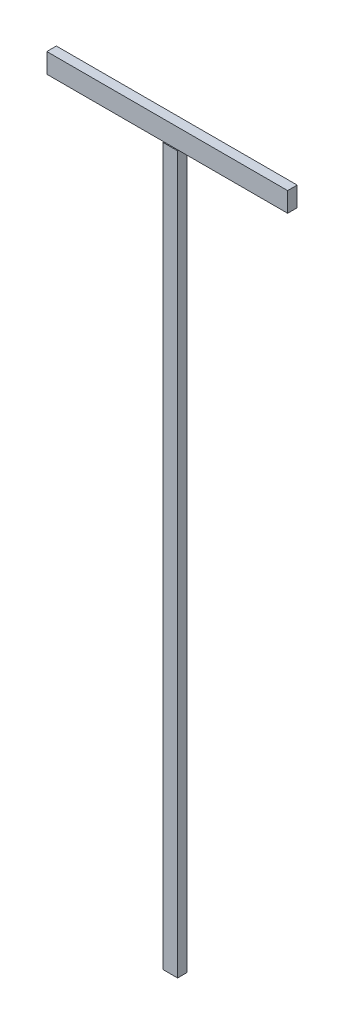
ISO-10303-21;
HEADER;
FILE_DESCRIPTION(('STEP AP214'),'2;1');
FILE_NAME('part.step','',(''),(''),'','','');
FILE_SCHEMA(('AUTOMOTIVE_DESIGN { 1 0 10303 214 1 1 1 1 }'));
ENDSEC;
DATA;
#1=APPLICATION_CONTEXT('core data for automotive mechanical design processes');
#2=APPLICATION_PROTOCOL_DEFINITION('international standard','automotive_design',2000,#1);
#3=PRODUCT_CONTEXT('',#1,'mechanical');
#4=PRODUCT('Part','Part','',(#3));
#5=PRODUCT_RELATED_PRODUCT_CATEGORY('part','',(#4));
#6=PRODUCT_DEFINITION_FORMATION('','',#4);
#7=PRODUCT_DEFINITION_CONTEXT('part definition',#1,'design');
#8=PRODUCT_DEFINITION('design','',#6,#7);
#9=PRODUCT_DEFINITION_SHAPE('','',#8);
#10=(LENGTH_UNIT() NAMED_UNIT(*) SI_UNIT(.MILLI.,.METRE.));
#11=(NAMED_UNIT(*) PLANE_ANGLE_UNIT() SI_UNIT($,.RADIAN.));
#12=(NAMED_UNIT(*) SI_UNIT($,.STERADIAN.) SOLID_ANGLE_UNIT());
#13=UNCERTAINTY_MEASURE_WITH_UNIT(LENGTH_MEASURE(1.E-05),#10,'distance_accuracy_value','');
#14=(GEOMETRIC_REPRESENTATION_CONTEXT(3) GLOBAL_UNCERTAINTY_ASSIGNED_CONTEXT((#13)) GLOBAL_UNIT_ASSIGNED_CONTEXT((#10,
#11,#12)) REPRESENTATION_CONTEXT('',''));
#15=CARTESIAN_POINT('',(0.,0.,0.));
#16=DIRECTION('',(0.,0.,1.));
#17=DIRECTION('',(1.,0.,0.));
#18=AXIS2_PLACEMENT_3D('',#15,#16,#17);
#19=CARTESIAN_POINT('',(51.7854430086385,-724.036701923933,10.));
#20=DIRECTION('',(0.,1.,0.));
#21=DIRECTION('',(0.,0.,1.));
#22=AXIS2_PLACEMENT_3D('',#19,#20,#21);
#23=PLANE('',#22);
#24=DIRECTION('',(1.,0.,0.));
#25=VECTOR('',#24,1.);
#26=CARTESIAN_POINT('',(51.7854430086385,-724.036701923933,0.));
#27=LINE('',#26,#25);
#28=CARTESIAN_POINT('',(51.7854430086385,-724.036701923933,0.));
#29=VERTEX_POINT('',#28);
#30=CARTESIAN_POINT('',(67.1330042148025,-724.036701923933,0.));
#31=VERTEX_POINT('',#30);
#32=EDGE_CURVE('E12',#29,#31,#27,.T.);
#33=ORIENTED_EDGE('',*,*,#32,.T.);
#34=DIRECTION('',(0.,0.,-1.));
#35=VECTOR('',#34,1.);
#36=CARTESIAN_POINT('',(67.1330042148025,-724.036701923933,10.));
#37=LINE('',#36,#35);
#38=CARTESIAN_POINT('',(67.1330042148025,-724.036701923933,10.));
#39=VERTEX_POINT('',#38);
#40=EDGE_CURVE('E66',#39,#31,#37,.T.);
#41=ORIENTED_EDGE('',*,*,#40,.F.);
#42=DIRECTION('',(1.,0.,0.));
#43=VECTOR('',#42,1.);
#44=CARTESIAN_POINT('',(51.7854430086385,-724.036701923933,10.));
#45=LINE('',#44,#43);
#46=CARTESIAN_POINT('',(51.7854430086385,-724.036701923933,10.));
#47=VERTEX_POINT('',#46);
#48=EDGE_CURVE('E51',#47,#39,#45,.T.);
#49=ORIENTED_EDGE('',*,*,#48,.F.);
#50=DIRECTION('',(0.,0.,-1.));
#51=VECTOR('',#50,1.);
#52=CARTESIAN_POINT('',(51.7854430086385,-724.036701923933,10.));
#53=LINE('',#52,#51);
#54=EDGE_CURVE('E101',#47,#29,#53,.T.);
#55=ORIENTED_EDGE('',*,*,#54,.T.);
#56=EDGE_LOOP('',(#33,#41,#49,#55));
#57=FACE_BOUND('',#56,.T.);
#58=ADVANCED_FACE('F47',(#57),#23,.F.);
#59=CARTESIAN_POINT('',(67.1330042148024,25.504850539847,10.));
#60=DIRECTION('',(1.,0.,0.));
#61=DIRECTION('',(0.,1.,0.));
#62=AXIS2_PLACEMENT_3D('',#59,#60,#61);
#63=PLANE('',#62);
#64=DIRECTION('',(0.,-1.,0.));
#65=VECTOR('',#64,1.);
#66=CARTESIAN_POINT('',(67.1330042148024,25.504850539847,0.));
#67=LINE('',#66,#65);
#68=CARTESIAN_POINT('',(67.1330042148024,25.504850539847,0.));
#69=VERTEX_POINT('',#68);
#70=EDGE_CURVE('E57',#69,#31,#67,.T.);
#71=ORIENTED_EDGE('',*,*,#70,.F.);
#72=DIRECTION('',(0.,0.,-1.));
#73=VECTOR('',#72,1.);
#74=CARTESIAN_POINT('',(67.1330042148024,25.504850539847,10.));
#75=LINE('',#74,#73);
#76=CARTESIAN_POINT('',(67.1330042148024,25.504850539847,10.));
#77=VERTEX_POINT('',#76);
#78=EDGE_CURVE('E79',#77,#69,#75,.T.);
#79=ORIENTED_EDGE('',*,*,#78,.F.);
#80=DIRECTION('',(0.,-1.,0.));
#81=VECTOR('',#80,1.);
#82=CARTESIAN_POINT('',(67.1330042148024,25.504850539847,10.));
#83=LINE('',#82,#81);
#84=EDGE_CURVE('E117',#77,#39,#83,.T.);
#85=ORIENTED_EDGE('',*,*,#84,.T.);
#86=ORIENTED_EDGE('',*,*,#40,.T.);
#87=EDGE_LOOP('',(#71,#79,#85,#86));
#88=FACE_BOUND('',#87,.T.);
#89=ADVANCED_FACE('F118',(#88),#63,.T.);
#90=CARTESIAN_POINT('',(51.7854430086384,25.504850539847,10.));
#91=DIRECTION('',(0.,1.,0.));
#92=DIRECTION('',(0.,0.,1.));
#93=AXIS2_PLACEMENT_3D('',#90,#91,#92);
#94=PLANE('',#93);
#95=DIRECTION('',(1.,0.,0.));
#96=VECTOR('',#95,1.);
#97=CARTESIAN_POINT('',(51.7854430086384,25.504850539847,0.));
#98=LINE('',#97,#96);
#99=CARTESIAN_POINT('',(51.7854430086384,25.504850539847,0.));
#100=VERTEX_POINT('',#99);
#101=EDGE_CURVE('E108',#100,#69,#98,.T.);
#102=ORIENTED_EDGE('',*,*,#101,.F.);
#103=DIRECTION('',(0.,0.,-1.));
#104=VECTOR('',#103,1.);
#105=CARTESIAN_POINT('',(51.7854430086384,25.504850539847,10.));
#106=LINE('',#105,#104);
#107=CARTESIAN_POINT('',(51.7854430086384,25.504850539847,10.));
#108=VERTEX_POINT('',#107);
#109=EDGE_CURVE('E94',#108,#100,#106,.T.);
#110=ORIENTED_EDGE('',*,*,#109,.F.);
#111=DIRECTION('',(1.,0.,0.));
#112=VECTOR('',#111,1.);
#113=CARTESIAN_POINT('',(51.7854430086384,25.504850539847,10.));
#114=LINE('',#113,#112);
#115=EDGE_CURVE('E116',#108,#77,#114,.T.);
#116=ORIENTED_EDGE('',*,*,#115,.T.);
#117=ORIENTED_EDGE('',*,*,#78,.T.);
#118=EDGE_LOOP('',(#102,#110,#116,#117));
#119=FACE_BOUND('',#118,.T.);
#120=ADVANCED_FACE('F110',(#119),#94,.T.);
#121=CARTESIAN_POINT('',(51.7854430086384,25.504850539847,10.));
#122=DIRECTION('',(1.,0.,0.));
#123=DIRECTION('',(0.,1.,0.));
#124=AXIS2_PLACEMENT_3D('',#121,#122,#123);
#125=PLANE('',#124);
#126=DIRECTION('',(0.,-1.,0.));
#127=VECTOR('',#126,1.);
#128=CARTESIAN_POINT('',(51.7854430086384,25.504850539847,0.));
#129=LINE('',#128,#127);
#130=EDGE_CURVE('E91',#100,#29,#129,.T.);
#131=ORIENTED_EDGE('',*,*,#130,.T.);
#132=ORIENTED_EDGE('',*,*,#54,.F.);
#133=DIRECTION('',(0.,-1.,0.));
#134=VECTOR('',#133,1.);
#135=CARTESIAN_POINT('',(51.7854430086384,25.504850539847,10.));
#136=LINE('',#135,#134);
#137=EDGE_CURVE('E96',#108,#47,#136,.T.);
#138=ORIENTED_EDGE('',*,*,#137,.F.);
#139=ORIENTED_EDGE('',*,*,#109,.T.);
#140=EDGE_LOOP('',(#131,#132,#138,#139));
#141=FACE_BOUND('',#140,.T.);
#142=ADVANCED_FACE('F95',(#141),#125,.F.);
#143=CARTESIAN_POINT('',(0.,0.,10.));
#144=DIRECTION('',(0.,0.,-1.));
#145=DIRECTION('',(-1.,0.,0.));
#146=AXIS2_PLACEMENT_3D('',#143,#144,#145);
#147=PLANE('',#146);
#148=ORIENTED_EDGE('',*,*,#48,.T.);
#149=ORIENTED_EDGE('',*,*,#84,.F.);
#150=ORIENTED_EDGE('',*,*,#115,.F.);
#151=ORIENTED_EDGE('',*,*,#137,.T.);
#152=EDGE_LOOP('',(#148,#149,#150,#151));
#153=FACE_BOUND('',#152,.T.);
#154=ADVANCED_FACE('F49',(#153),#147,.F.);
#155=CARTESIAN_POINT('',(0.,0.,0.));
#156=DIRECTION('',(0.,0.,-1.));
#157=DIRECTION('',(-1.,0.,0.));
#158=AXIS2_PLACEMENT_3D('',#155,#156,#157);
#159=PLANE('',#158);
#160=ORIENTED_EDGE('',*,*,#32,.F.);
#161=ORIENTED_EDGE('',*,*,#130,.F.);
#162=ORIENTED_EDGE('',*,*,#101,.T.);
#163=ORIENTED_EDGE('',*,*,#70,.T.);
#164=EDGE_LOOP('',(#160,#161,#162,#163));
#165=FACE_BOUND('',#164,.T.);
#166=ADVANCED_FACE('F106',(#165),#159,.T.);
#167=CLOSED_SHELL('',(#58,#89,#120,#142,#154,#166));
#168=MANIFOLD_SOLID_BREP('B2',#167);
#169=CARTESIAN_POINT('',(0.,26.4919169950417,10.));
#170=DIRECTION('',(0.,1.,0.));
#171=DIRECTION('',(0.,0.,1.));
#172=AXIS2_PLACEMENT_3D('',#169,#170,#171);
#173=PLANE('',#172);
#174=DIRECTION('',(1.,0.,0.));
#175=VECTOR('',#174,1.);
#176=CARTESIAN_POINT('',(0.,26.4919169950417,0.));
#177=LINE('',#176,#175);
#178=CARTESIAN_POINT('',(-69.7429665059985,26.4919169950417,0.));
#179=VERTEX_POINT('',#178);
#180=CARTESIAN_POINT('',(182.293512921319,26.4919169950417,0.));
#181=VERTEX_POINT('',#180);
#182=EDGE_CURVE('E234',#179,#181,#177,.T.);
#183=ORIENTED_EDGE('',*,*,#182,.T.);
#184=DIRECTION('',(0.,0.,-1.));
#185=VECTOR('',#184,1.);
#186=CARTESIAN_POINT('',(182.293512921319,26.4919169950417,10.));
#187=LINE('',#186,#185);
#188=CARTESIAN_POINT('',(182.293512921319,26.4919169950417,10.));
#189=VERTEX_POINT('',#188);
#190=EDGE_CURVE('E45',#189,#181,#187,.T.);
#191=ORIENTED_EDGE('',*,*,#190,.F.);
#192=DIRECTION('',(1.,0.,0.));
#193=VECTOR('',#192,1.);
#194=CARTESIAN_POINT('',(0.,26.4919169950417,10.));
#195=LINE('',#194,#193);
#196=CARTESIAN_POINT('',(-69.7429665059985,26.4919169950417,10.));
#197=VERTEX_POINT('',#196);
#198=EDGE_CURVE('E220',#197,#189,#195,.T.);
#199=ORIENTED_EDGE('',*,*,#198,.F.);
#200=DIRECTION('',(0.,0.,-1.));
#201=VECTOR('',#200,1.);
#202=CARTESIAN_POINT('',(-69.7429665059985,26.4919169950417,10.));
#203=LINE('',#202,#201);
#204=EDGE_CURVE('E187',#197,#179,#203,.T.);
#205=ORIENTED_EDGE('',*,*,#204,.T.);
#206=EDGE_LOOP('',(#183,#191,#199,#205));
#207=FACE_BOUND('',#206,.T.);
#208=ADVANCED_FACE('F171',(#207),#173,.F.);
#209=CARTESIAN_POINT('',(182.293512921319,0.,10.));
#210=DIRECTION('',(-1.,0.,0.));
#211=DIRECTION('',(0.,0.,1.));
#212=AXIS2_PLACEMENT_3D('',#209,#210,#211);
#213=PLANE('',#212);
#214=DIRECTION('',(0.,1.,0.));
#215=VECTOR('',#214,1.);
#216=CARTESIAN_POINT('',(182.293512921319,0.,0.));
#217=LINE('',#216,#215);
#218=CARTESIAN_POINT('',(182.293512921319,47.0820236651548,0.));
#219=VERTEX_POINT('',#218);
#220=EDGE_CURVE('E225',#181,#219,#217,.T.);
#221=ORIENTED_EDGE('',*,*,#220,.T.);
#222=DIRECTION('',(0.,0.,-1.));
#223=VECTOR('',#222,1.);
#224=CARTESIAN_POINT('',(182.293512921319,47.0820236651548,10.));
#225=LINE('',#224,#223);
#226=CARTESIAN_POINT('',(182.293512921319,47.0820236651548,10.));
#227=VERTEX_POINT('',#226);
#228=EDGE_CURVE('E179',#227,#219,#225,.T.);
#229=ORIENTED_EDGE('',*,*,#228,.F.);
#230=DIRECTION('',(0.,1.,0.));
#231=VECTOR('',#230,1.);
#232=CARTESIAN_POINT('',(182.293512921319,0.,10.));
#233=LINE('',#232,#231);
#234=EDGE_CURVE('E212',#189,#227,#233,.T.);
#235=ORIENTED_EDGE('',*,*,#234,.F.);
#236=ORIENTED_EDGE('',*,*,#190,.T.);
#237=EDGE_LOOP('',(#221,#229,#235,#236));
#238=FACE_BOUND('',#237,.T.);
#239=ADVANCED_FACE('F224',(#238),#213,.F.);
#240=CARTESIAN_POINT('',(0.,47.0820236651548,10.));
#241=DIRECTION('',(0.,1.,0.));
#242=DIRECTION('',(0.,0.,1.));
#243=AXIS2_PLACEMENT_3D('',#240,#241,#242);
#244=PLANE('',#243);
#245=DIRECTION('',(1.,0.,0.));
#246=VECTOR('',#245,1.);
#247=CARTESIAN_POINT('',(0.,47.0820236651548,0.));
#248=LINE('',#247,#246);
#249=CARTESIAN_POINT('',(-69.7429665059985,47.0820236651548,0.));
#250=VERTEX_POINT('',#249);
#251=EDGE_CURVE('E237',#250,#219,#248,.T.);
#252=ORIENTED_EDGE('',*,*,#251,.F.);
#253=DIRECTION('',(0.,0.,-1.));
#254=VECTOR('',#253,1.);
#255=CARTESIAN_POINT('',(-69.7429665059985,47.0820236651548,10.));
#256=LINE('',#255,#254);
#257=CARTESIAN_POINT('',(-69.7429665059985,47.0820236651548,10.));
#258=VERTEX_POINT('',#257);
#259=EDGE_CURVE('E201',#258,#250,#256,.T.);
#260=ORIENTED_EDGE('',*,*,#259,.F.);
#261=DIRECTION('',(1.,0.,0.));
#262=VECTOR('',#261,1.);
#263=CARTESIAN_POINT('',(0.,47.0820236651548,10.));
#264=LINE('',#263,#262);
#265=EDGE_CURVE('E219',#258,#227,#264,.T.);
#266=ORIENTED_EDGE('',*,*,#265,.T.);
#267=ORIENTED_EDGE('',*,*,#228,.T.);
#268=EDGE_LOOP('',(#252,#260,#266,#267));
#269=FACE_BOUND('',#268,.T.);
#270=ADVANCED_FACE('F228',(#269),#244,.T.);
#271=CARTESIAN_POINT('',(-69.7429665059985,0.,10.));
#272=DIRECTION('',(-1.,0.,0.));
#273=DIRECTION('',(0.,0.,1.));
#274=AXIS2_PLACEMENT_3D('',#271,#272,#273);
#275=PLANE('',#274);
#276=DIRECTION('',(0.,1.,0.));
#277=VECTOR('',#276,1.);
#278=CARTESIAN_POINT('',(-69.7429665059985,0.,0.));
#279=LINE('',#278,#277);
#280=EDGE_CURVE('E239',#179,#250,#279,.T.);
#281=ORIENTED_EDGE('',*,*,#280,.F.);
#282=ORIENTED_EDGE('',*,*,#204,.F.);
#283=DIRECTION('',(0.,1.,0.));
#284=VECTOR('',#283,1.);
#285=CARTESIAN_POINT('',(-69.7429665059985,0.,10.));
#286=LINE('',#285,#284);
#287=EDGE_CURVE('E229',#197,#258,#286,.T.);
#288=ORIENTED_EDGE('',*,*,#287,.T.);
#289=ORIENTED_EDGE('',*,*,#259,.T.);
#290=EDGE_LOOP('',(#281,#282,#288,#289));
#291=FACE_BOUND('',#290,.T.);
#292=ADVANCED_FACE('F245',(#291),#275,.T.);
#293=CARTESIAN_POINT('',(0.,0.,10.));
#294=DIRECTION('',(0.,0.,1.));
#295=DIRECTION('',(1.,0.,0.));
#296=AXIS2_PLACEMENT_3D('',#293,#294,#295);
#297=PLANE('',#296);
#298=ORIENTED_EDGE('',*,*,#198,.T.);
#299=ORIENTED_EDGE('',*,*,#234,.T.);
#300=ORIENTED_EDGE('',*,*,#265,.F.);
#301=ORIENTED_EDGE('',*,*,#287,.F.);
#302=EDGE_LOOP('',(#298,#299,#300,#301));
#303=FACE_BOUND('',#302,.T.);
#304=ADVANCED_FACE('F216',(#303),#297,.T.);
#305=CARTESIAN_POINT('',(0.,0.,0.));
#306=DIRECTION('',(0.,0.,1.));
#307=DIRECTION('',(1.,0.,0.));
#308=AXIS2_PLACEMENT_3D('',#305,#306,#307);
#309=PLANE('',#308);
#310=ORIENTED_EDGE('',*,*,#182,.F.);
#311=ORIENTED_EDGE('',*,*,#280,.T.);
#312=ORIENTED_EDGE('',*,*,#251,.T.);
#313=ORIENTED_EDGE('',*,*,#220,.F.);
#314=EDGE_LOOP('',(#310,#311,#312,#313));
#315=FACE_BOUND('',#314,.T.);
#316=ADVANCED_FACE('F244',(#315),#309,.F.);
#317=CLOSED_SHELL('',(#208,#239,#270,#292,#304,#316));
#318=MANIFOLD_SOLID_BREP('B6',#317);
#319=ADVANCED_BREP_SHAPE_REPRESENTATION('',(#18,#168,#318),#14);
#320=SHAPE_DEFINITION_REPRESENTATION(#9,#319);
ENDSEC;
END-ISO-10303-21;
